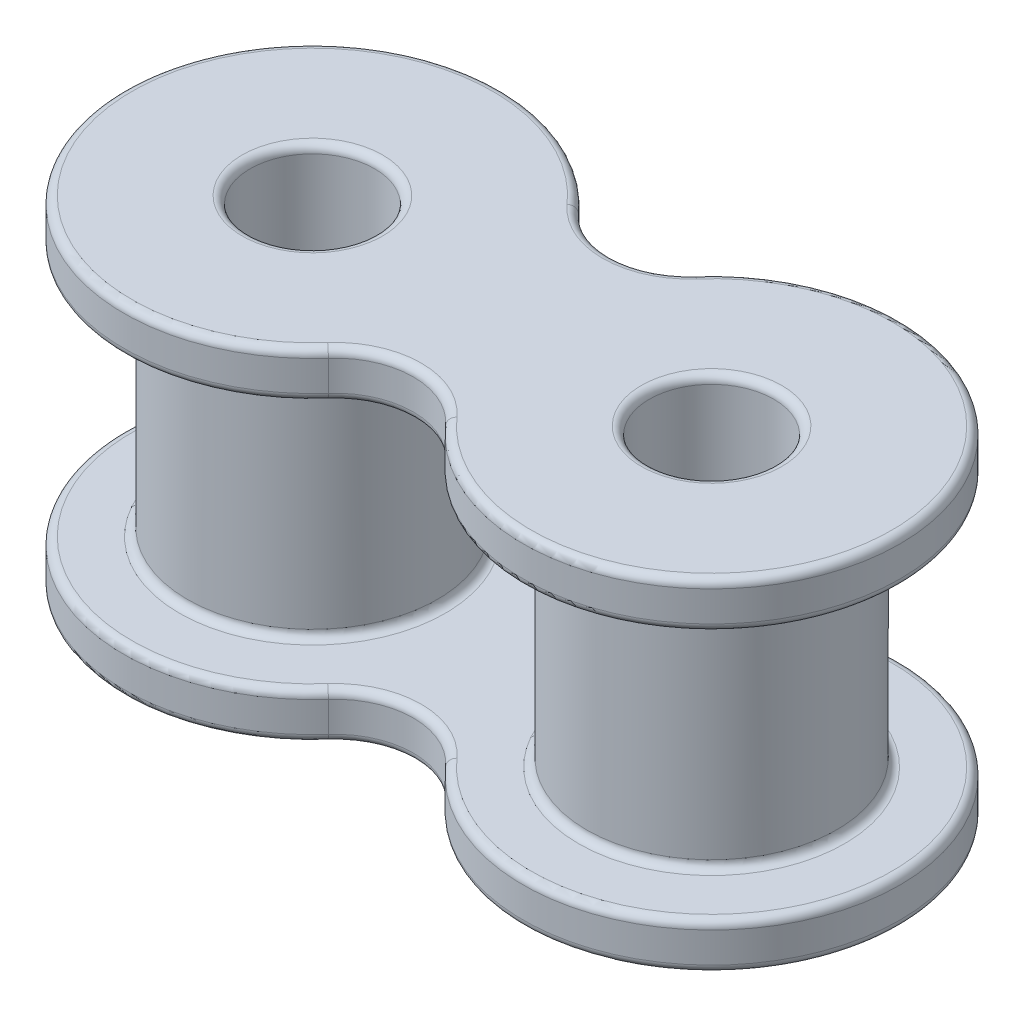
ISO-10303-21;
HEADER;
FILE_DESCRIPTION(('STEP AP214'),'2;1');
FILE_NAME('part.step','',(''),(''),'','','');
FILE_SCHEMA(('AUTOMOTIVE_DESIGN { 1 0 10303 214 1 1 1 1 }'));
ENDSEC;
DATA;
#1=APPLICATION_CONTEXT('core data for automotive mechanical design processes');
#2=APPLICATION_PROTOCOL_DEFINITION('international standard','automotive_design',2000,#1);
#3=PRODUCT_CONTEXT('',#1,'mechanical');
#4=PRODUCT('Part','Part','',(#3));
#5=PRODUCT_RELATED_PRODUCT_CATEGORY('part','',(#4));
#6=PRODUCT_DEFINITION_FORMATION('','',#4);
#7=PRODUCT_DEFINITION_CONTEXT('part definition',#1,'design');
#8=PRODUCT_DEFINITION('design','',#6,#7);
#9=PRODUCT_DEFINITION_SHAPE('','',#8);
#10=(LENGTH_UNIT() NAMED_UNIT(*) SI_UNIT(.MILLI.,.METRE.));
#11=(NAMED_UNIT(*) PLANE_ANGLE_UNIT() SI_UNIT($,.RADIAN.));
#12=(NAMED_UNIT(*) SI_UNIT($,.STERADIAN.) SOLID_ANGLE_UNIT());
#13=UNCERTAINTY_MEASURE_WITH_UNIT(LENGTH_MEASURE(1.E-05),#10,'distance_accuracy_value','');
#14=(GEOMETRIC_REPRESENTATION_CONTEXT(3) GLOBAL_UNCERTAINTY_ASSIGNED_CONTEXT((#13)) GLOBAL_UNIT_ASSIGNED_CONTEXT((#10,
#11,#12)) REPRESENTATION_CONTEXT('',''));
#15=CARTESIAN_POINT('',(0.,0.,0.));
#16=DIRECTION('',(0.,0.,1.));
#17=DIRECTION('',(1.,0.,0.));
#18=AXIS2_PLACEMENT_3D('',#15,#16,#17);
#19=CARTESIAN_POINT('',(3.175,0.7366,-2.81610900547326));
#20=DIRECTION('',(0.,1.,0.));
#21=DIRECTION('',(0.,0.,1.));
#22=AXIS2_PLACEMENT_3D('',#19,#20,#21);
#23=PLANE('',#22);
#24=CARTESIAN_POINT('',(-6.35,0.7366,0.));
#25=DIRECTION('',(0.,1.,0.));
#26=DIRECTION('',(0.,0.,1.));
#27=AXIS2_PLACEMENT_3D('',#24,#25,#26);
#28=CIRCLE('',#27,4.2291);
#29=CARTESIAN_POINT('',(-6.35,0.7366,4.2291));
#30=VERTEX_POINT('',#29);
#31=EDGE_CURVE('E201',#30,#30,#28,.F.);
#32=ORIENTED_EDGE('',*,*,#31,.T.);
#33=EDGE_LOOP('',(#32));
#34=FACE_BOUND('',#33,.T.);
#35=CARTESIAN_POINT('',(6.35,0.7366,0.));
#36=DIRECTION('',(0.,1.,0.));
#37=DIRECTION('',(0.,0.,1.));
#38=AXIS2_PLACEMENT_3D('',#35,#36,#37);
#39=CIRCLE('',#38,4.2291);
#40=CARTESIAN_POINT('',(6.35,0.7366,4.2291));
#41=VERTEX_POINT('',#40);
#42=EDGE_CURVE('E196',#41,#41,#39,.F.);
#43=ORIENTED_EDGE('',*,*,#42,.T.);
#44=EDGE_LOOP('',(#43));
#45=FACE_BOUND('',#44,.T.);
#46=CARTESIAN_POINT('',(6.35,0.7366,0.));
#47=DIRECTION('',(0.,1.,0.));
#48=DIRECTION('',(0.,0.,1.));
#49=AXIS2_PLACEMENT_3D('',#46,#47,#48);
#50=CIRCLE('',#49,5.7404);
#51=CARTESIAN_POINT('',(2.05546815225198,0.7366,3.80909285377477));
#52=VERTEX_POINT('',#51);
#53=CARTESIAN_POINT('',(2.05546815225198,0.7366,-3.80909285377477));
#54=VERTEX_POINT('',#53);
#55=EDGE_CURVE('E193',#52,#54,#50,.T.);
#56=ORIENTED_EDGE('',*,*,#55,.T.);
#57=CARTESIAN_POINT('',(0.,0.7366,-5.63221801094651));
#58=DIRECTION('',(0.,1.,0.));
#59=DIRECTION('',(0.,0.,1.));
#60=AXIS2_PLACEMENT_3D('',#57,#58,#59);
#61=CIRCLE('',#60,2.74749607163225);
#62=CARTESIAN_POINT('',(-2.05546815225198,0.7366,-3.80909285377477));
#63=VERTEX_POINT('',#62);
#64=EDGE_CURVE('E172',#54,#63,#61,.F.);
#65=ORIENTED_EDGE('',*,*,#64,.T.);
#66=CARTESIAN_POINT('',(-6.35,0.7366,0.));
#67=DIRECTION('',(0.,1.,0.));
#68=DIRECTION('',(0.,0.,1.));
#69=AXIS2_PLACEMENT_3D('',#66,#67,#68);
#70=CIRCLE('',#69,5.7404);
#71=CARTESIAN_POINT('',(-2.05546815225198,0.7366,3.80909285377477));
#72=VERTEX_POINT('',#71);
#73=EDGE_CURVE('E182',#63,#72,#70,.T.);
#74=ORIENTED_EDGE('',*,*,#73,.T.);
#75=CARTESIAN_POINT('',(0.,0.7366,5.63221801094651));
#76=DIRECTION('',(0.,1.,0.));
#77=DIRECTION('',(0.,0.,1.));
#78=AXIS2_PLACEMENT_3D('',#75,#76,#77);
#79=CIRCLE('',#78,2.74749607163225);
#80=EDGE_CURVE('E189',#72,#52,#79,.F.);
#81=ORIENTED_EDGE('',*,*,#80,.T.);
#82=EDGE_LOOP('',(#56,#65,#74,#81));
#83=FACE_BOUND('',#82,.T.);
#84=ADVANCED_FACE('F48',(#34,#45,#83),#23,.T.);
#85=CARTESIAN_POINT('',(3.175,-0.7366,-2.81610900547326));
#86=DIRECTION('',(0.,1.,0.));
#87=DIRECTION('',(0.,0.,1.));
#88=AXIS2_PLACEMENT_3D('',#85,#86,#87);
#89=PLANE('',#88);
#90=CARTESIAN_POINT('',(6.35,-0.7366,0.));
#91=DIRECTION('',(0.,1.,0.));
#92=DIRECTION('',(0.,0.,1.));
#93=AXIS2_PLACEMENT_3D('',#90,#91,#92);
#94=CIRCLE('',#93,2.2352);
#95=CARTESIAN_POINT('',(6.35,-0.7366,2.2352));
#96=VERTEX_POINT('',#95);
#97=EDGE_CURVE('E250',#96,#96,#94,.T.);
#98=ORIENTED_EDGE('',*,*,#97,.T.);
#99=EDGE_LOOP('',(#98));
#100=FACE_BOUND('',#99,.T.);
#101=CARTESIAN_POINT('',(-6.35,-0.7366,0.));
#102=DIRECTION('',(0.,1.,0.));
#103=DIRECTION('',(0.,0.,1.));
#104=AXIS2_PLACEMENT_3D('',#101,#102,#103);
#105=CIRCLE('',#104,2.2352);
#106=CARTESIAN_POINT('',(-6.35,-0.7366,2.2352));
#107=VERTEX_POINT('',#106);
#108=EDGE_CURVE('E246',#107,#107,#105,.T.);
#109=ORIENTED_EDGE('',*,*,#108,.T.);
#110=EDGE_LOOP('',(#109));
#111=FACE_BOUND('',#110,.T.);
#112=CARTESIAN_POINT('',(0.,-0.7366,5.63221801094651));
#113=DIRECTION('',(0.,1.,0.));
#114=DIRECTION('',(0.,0.,1.));
#115=AXIS2_PLACEMENT_3D('',#112,#113,#114);
#116=CIRCLE('',#115,2.74749607163225);
#117=CARTESIAN_POINT('',(2.05546815225198,-0.7366,3.80909285377476));
#118=VERTEX_POINT('',#117);
#119=CARTESIAN_POINT('',(-2.05546815225198,-0.7366,3.80909285377476));
#120=VERTEX_POINT('',#119);
#121=EDGE_CURVE('E236',#118,#120,#116,.T.);
#122=ORIENTED_EDGE('',*,*,#121,.T.);
#123=CARTESIAN_POINT('',(-6.35,-0.7366,0.));
#124=DIRECTION('',(0.,1.,0.));
#125=DIRECTION('',(0.,0.,1.));
#126=AXIS2_PLACEMENT_3D('',#123,#124,#125);
#127=CIRCLE('',#126,5.7404);
#128=CARTESIAN_POINT('',(-2.05546815225198,-0.7366,-3.80909285377477));
#129=VERTEX_POINT('',#128);
#130=EDGE_CURVE('E242',#120,#129,#127,.F.);
#131=ORIENTED_EDGE('',*,*,#130,.T.);
#132=CARTESIAN_POINT('',(0.,-0.7366,-5.63221801094651));
#133=DIRECTION('',(0.,1.,0.));
#134=DIRECTION('',(0.,0.,1.));
#135=AXIS2_PLACEMENT_3D('',#132,#133,#134);
#136=CIRCLE('',#135,2.74749607163225);
#137=CARTESIAN_POINT('',(2.05546815225198,-0.7366,-3.80909285377477));
#138=VERTEX_POINT('',#137);
#139=EDGE_CURVE('E239',#129,#138,#136,.T.);
#140=ORIENTED_EDGE('',*,*,#139,.T.);
#141=CARTESIAN_POINT('',(6.35,-0.7366,0.));
#142=DIRECTION('',(0.,1.,0.));
#143=DIRECTION('',(0.,0.,1.));
#144=AXIS2_PLACEMENT_3D('',#141,#142,#143);
#145=CIRCLE('',#144,5.7404);
#146=EDGE_CURVE('E233',#138,#118,#145,.F.);
#147=ORIENTED_EDGE('',*,*,#146,.T.);
#148=EDGE_LOOP('',(#122,#131,#140,#147));
#149=FACE_BOUND('',#148,.T.);
#150=ADVANCED_FACE('F469',(#100,#111,#149),#89,.F.);
#151=CARTESIAN_POINT('',(0.,0.7366,-5.63221801094651));
#152=DIRECTION('',(0.,-1.,0.));
#153=DIRECTION('',(0.,0.,-1.));
#154=AXIS2_PLACEMENT_3D('',#151,#152,#153);
#155=CYLINDRICAL_SURFACE('',#154,2.49349607163225);
#156=DIRECTION('',(0.,-1.,0.));
#157=VECTOR('',#156,1.);
#158=CARTESIAN_POINT('',(-1.86544461916579,0.7366,-3.97763678535772));
#159=LINE('',#158,#157);
#160=CARTESIAN_POINT('',(-1.86544461916579,0.4826,-3.97763678535772));
#161=VERTEX_POINT('',#160);
#162=CARTESIAN_POINT('',(-1.86544461916579,-0.4826,-3.97763678535772));
#163=VERTEX_POINT('',#162);
#164=EDGE_CURVE('E190',#161,#163,#159,.T.);
#165=ORIENTED_EDGE('',*,*,#164,.F.);
#166=CARTESIAN_POINT('',(0.,0.4826,-5.63221801094651));
#167=DIRECTION('',(0.,1.,0.));
#168=DIRECTION('',(0.,0.,1.));
#169=AXIS2_PLACEMENT_3D('',#166,#167,#168);
#170=CIRCLE('',#169,2.49349607163225);
#171=CARTESIAN_POINT('',(1.86544461916579,0.4826,-3.97763678535772));
#172=VERTEX_POINT('',#171);
#173=EDGE_CURVE('E174',#161,#172,#170,.T.);
#174=ORIENTED_EDGE('',*,*,#173,.T.);
#175=DIRECTION('',(0.,-1.,0.));
#176=VECTOR('',#175,1.);
#177=CARTESIAN_POINT('',(1.86544461916579,0.7366,-3.97763678535772));
#178=LINE('',#177,#176);
#179=CARTESIAN_POINT('',(1.86544461916579,-0.4826,-3.97763678535772));
#180=VERTEX_POINT('',#179);
#181=EDGE_CURVE('E279',#172,#180,#178,.T.);
#182=ORIENTED_EDGE('',*,*,#181,.T.);
#183=CARTESIAN_POINT('',(0.,-0.4826,-5.63221801094651));
#184=DIRECTION('',(0.,1.,0.));
#185=DIRECTION('',(0.,0.,1.));
#186=AXIS2_PLACEMENT_3D('',#183,#184,#185);
#187=CIRCLE('',#186,2.49349607163225);
#188=EDGE_CURVE('E209',#180,#163,#187,.F.);
#189=ORIENTED_EDGE('',*,*,#188,.T.);
#190=EDGE_LOOP('',(#165,#174,#182,#189));
#191=FACE_BOUND('',#190,.T.);
#192=ADVANCED_FACE('F453',(#191),#155,.F.);
#193=CARTESIAN_POINT('',(-6.35,0.7366,0.));
#194=DIRECTION('',(0.,-1.,0.));
#195=DIRECTION('',(0.,0.,-1.));
#196=AXIS2_PLACEMENT_3D('',#193,#194,#195);
#197=CYLINDRICAL_SURFACE('',#196,5.9944);
#198=ORIENTED_EDGE('',*,*,#164,.T.);
#199=CARTESIAN_POINT('',(-6.35,-0.4826,0.));
#200=DIRECTION('',(0.,1.,0.));
#201=DIRECTION('',(0.,0.,1.));
#202=AXIS2_PLACEMENT_3D('',#199,#200,#201);
#203=CIRCLE('',#202,5.9944);
#204=CARTESIAN_POINT('',(-1.86544461916578,-0.4826,3.97763678535772));
#205=VERTEX_POINT('',#204);
#206=EDGE_CURVE('E229',#163,#205,#203,.T.);
#207=ORIENTED_EDGE('',*,*,#206,.T.);
#208=DIRECTION('',(0.,-1.,0.));
#209=VECTOR('',#208,1.);
#210=CARTESIAN_POINT('',(-1.86544461916578,0.7366,3.97763678535772));
#211=LINE('',#210,#209);
#212=CARTESIAN_POINT('',(-1.86544461916578,0.4826,3.97763678535772));
#213=VERTEX_POINT('',#212);
#214=EDGE_CURVE('E434',#213,#205,#211,.T.);
#215=ORIENTED_EDGE('',*,*,#214,.F.);
#216=CARTESIAN_POINT('',(-6.35,0.4826,0.));
#217=DIRECTION('',(0.,1.,0.));
#218=DIRECTION('',(0.,0.,1.));
#219=AXIS2_PLACEMENT_3D('',#216,#217,#218);
#220=CIRCLE('',#219,5.9944);
#221=EDGE_CURVE('E226',#213,#161,#220,.F.);
#222=ORIENTED_EDGE('',*,*,#221,.T.);
#223=EDGE_LOOP('',(#198,#207,#215,#222));
#224=FACE_BOUND('',#223,.T.);
#225=ADVANCED_FACE('F478',(#224),#197,.T.);
#226=CARTESIAN_POINT('',(0.,0.7366,5.63221801094651));
#227=DIRECTION('',(0.,-1.,0.));
#228=DIRECTION('',(0.,0.,-1.));
#229=AXIS2_PLACEMENT_3D('',#226,#227,#228);
#230=CYLINDRICAL_SURFACE('',#229,2.49349607163225);
#231=DIRECTION('',(0.,-1.,0.));
#232=VECTOR('',#231,1.);
#233=CARTESIAN_POINT('',(1.86544461916579,0.7366,3.97763678535772));
#234=LINE('',#233,#232);
#235=CARTESIAN_POINT('',(1.86544461916579,0.4826,3.97763678535772));
#236=VERTEX_POINT('',#235);
#237=CARTESIAN_POINT('',(1.86544461916579,-0.4826,3.97763678535772));
#238=VERTEX_POINT('',#237);
#239=EDGE_CURVE('E430',#236,#238,#234,.T.);
#240=ORIENTED_EDGE('',*,*,#239,.F.);
#241=CARTESIAN_POINT('',(0.,0.4826,5.63221801094651));
#242=DIRECTION('',(0.,1.,0.));
#243=DIRECTION('',(0.,0.,1.));
#244=AXIS2_PLACEMENT_3D('',#241,#242,#243);
#245=CIRCLE('',#244,2.49349607163225);
#246=EDGE_CURVE('E223',#236,#213,#245,.T.);
#247=ORIENTED_EDGE('',*,*,#246,.T.);
#248=ORIENTED_EDGE('',*,*,#214,.T.);
#249=CARTESIAN_POINT('',(0.,-0.4826,5.63221801094651));
#250=DIRECTION('',(0.,1.,0.));
#251=DIRECTION('',(0.,0.,1.));
#252=AXIS2_PLACEMENT_3D('',#249,#250,#251);
#253=CIRCLE('',#252,2.49349607163225);
#254=EDGE_CURVE('E220',#205,#238,#253,.F.);
#255=ORIENTED_EDGE('',*,*,#254,.T.);
#256=EDGE_LOOP('',(#240,#247,#248,#255));
#257=FACE_BOUND('',#256,.T.);
#258=ADVANCED_FACE('F481',(#257),#230,.F.);
#259=CARTESIAN_POINT('',(6.35,0.7366,0.));
#260=DIRECTION('',(0.,-1.,0.));
#261=DIRECTION('',(0.,0.,-1.));
#262=AXIS2_PLACEMENT_3D('',#259,#260,#261);
#263=CYLINDRICAL_SURFACE('',#262,5.9944);
#264=ORIENTED_EDGE('',*,*,#181,.F.);
#265=CARTESIAN_POINT('',(6.35,0.4826,0.));
#266=DIRECTION('',(0.,1.,0.));
#267=DIRECTION('',(0.,0.,1.));
#268=AXIS2_PLACEMENT_3D('',#265,#266,#267);
#269=CIRCLE('',#268,5.9944);
#270=EDGE_CURVE('E217',#172,#236,#269,.F.);
#271=ORIENTED_EDGE('',*,*,#270,.T.);
#272=ORIENTED_EDGE('',*,*,#239,.T.);
#273=CARTESIAN_POINT('',(6.35,-0.4826,0.));
#274=DIRECTION('',(0.,1.,0.));
#275=DIRECTION('',(0.,0.,1.));
#276=AXIS2_PLACEMENT_3D('',#273,#274,#275);
#277=CIRCLE('',#276,5.9944);
#278=EDGE_CURVE('E214',#238,#180,#277,.T.);
#279=ORIENTED_EDGE('',*,*,#278,.T.);
#280=EDGE_LOOP('',(#264,#271,#272,#279));
#281=FACE_BOUND('',#280,.T.);
#282=ADVANCED_FACE('F455',(#281),#263,.T.);
#283=CARTESIAN_POINT('',(-6.35,0.7366,0.));
#284=DIRECTION('',(0.,-1.,0.));
#285=DIRECTION('',(0.,0.,-1.));
#286=AXIS2_PLACEMENT_3D('',#283,#284,#285);
#287=CYLINDRICAL_SURFACE('',#286,1.9812);
#288=CARTESIAN_POINT('',(-6.35,9.8806,0.));
#289=DIRECTION('',(0.,-1.,0.));
#290=DIRECTION('',(0.,0.,-1.));
#291=AXIS2_PLACEMENT_3D('',#288,#289,#290);
#292=CIRCLE('',#291,1.9812);
#293=CARTESIAN_POINT('',(-6.35,9.8806,-1.9812));
#294=VERTEX_POINT('',#293);
#295=EDGE_CURVE('E11',#294,#294,#292,.F.);
#296=ORIENTED_EDGE('',*,*,#295,.T.);
#297=EDGE_LOOP('',(#296));
#298=FACE_BOUND('',#297,.T.);
#299=CARTESIAN_POINT('',(-6.35,-0.4826,0.));
#300=DIRECTION('',(0.,1.,0.));
#301=DIRECTION('',(0.,0.,1.));
#302=AXIS2_PLACEMENT_3D('',#299,#300,#301);
#303=CIRCLE('',#302,1.9812);
#304=CARTESIAN_POINT('',(-6.35,-0.4826,1.9812));
#305=VERTEX_POINT('',#304);
#306=EDGE_CURVE('E266',#305,#305,#303,.F.);
#307=ORIENTED_EDGE('',*,*,#306,.T.);
#308=EDGE_LOOP('',(#307));
#309=FACE_BOUND('',#308,.T.);
#310=ADVANCED_FACE('F488',(#298,#309),#287,.F.);
#311=CARTESIAN_POINT('',(6.35,0.7366,0.));
#312=DIRECTION('',(0.,-1.,0.));
#313=DIRECTION('',(0.,0.,-1.));
#314=AXIS2_PLACEMENT_3D('',#311,#312,#313);
#315=CYLINDRICAL_SURFACE('',#314,1.9812);
#316=CARTESIAN_POINT('',(6.35,9.8806,0.));
#317=DIRECTION('',(0.,-1.,0.));
#318=DIRECTION('',(0.,0.,-1.));
#319=AXIS2_PLACEMENT_3D('',#316,#317,#318);
#320=CIRCLE('',#319,1.9812);
#321=CARTESIAN_POINT('',(6.35,9.8806,-1.9812));
#322=VERTEX_POINT('',#321);
#323=EDGE_CURVE('E58',#322,#322,#320,.F.);
#324=ORIENTED_EDGE('',*,*,#323,.T.);
#325=EDGE_LOOP('',(#324));
#326=FACE_BOUND('',#325,.T.);
#327=CARTESIAN_POINT('',(6.35,-0.4826,0.));
#328=DIRECTION('',(0.,1.,0.));
#329=DIRECTION('',(0.,0.,1.));
#330=AXIS2_PLACEMENT_3D('',#327,#328,#329);
#331=CIRCLE('',#330,1.9812);
#332=CARTESIAN_POINT('',(6.35,-0.4826,1.9812));
#333=VERTEX_POINT('',#332);
#334=EDGE_CURVE('E262',#333,#333,#331,.F.);
#335=ORIENTED_EDGE('',*,*,#334,.T.);
#336=EDGE_LOOP('',(#335));
#337=FACE_BOUND('',#336,.T.);
#338=ADVANCED_FACE('F503',(#326,#337),#315,.F.);
#339=CARTESIAN_POINT('',(6.35,8.6614,0.));
#340=DIRECTION('',(0.,-1.,0.));
#341=DIRECTION('',(0.,0.,-1.));
#342=AXIS2_PLACEMENT_3D('',#339,#340,#341);
#343=CYLINDRICAL_SURFACE('',#342,3.9751);
#344=CARTESIAN_POINT('',(6.35,8.4074,0.));
#345=DIRECTION('',(0.,-1.,0.));
#346=DIRECTION('',(0.,0.,-1.));
#347=AXIS2_PLACEMENT_3D('',#344,#345,#346);
#348=CIRCLE('',#347,3.9751);
#349=CARTESIAN_POINT('',(6.35,8.4074,-3.9751));
#350=VERTEX_POINT('',#349);
#351=EDGE_CURVE('E363',#350,#350,#348,.T.);
#352=ORIENTED_EDGE('',*,*,#351,.T.);
#353=EDGE_LOOP('',(#352));
#354=FACE_BOUND('',#353,.T.);
#355=CARTESIAN_POINT('',(6.35,0.990599999999999,0.));
#356=DIRECTION('',(0.,1.,0.));
#357=DIRECTION('',(0.,0.,1.));
#358=AXIS2_PLACEMENT_3D('',#355,#356,#357);
#359=CIRCLE('',#358,3.9751);
#360=CARTESIAN_POINT('',(6.35,0.990599999999999,3.9751));
#361=VERTEX_POINT('',#360);
#362=EDGE_CURVE('E258',#361,#361,#359,.T.);
#363=ORIENTED_EDGE('',*,*,#362,.T.);
#364=EDGE_LOOP('',(#363));
#365=FACE_BOUND('',#364,.T.);
#366=ADVANCED_FACE('F507',(#354,#365),#343,.T.);
#367=CARTESIAN_POINT('',(-6.35,8.6614,0.));
#368=DIRECTION('',(0.,-1.,0.));
#369=DIRECTION('',(0.,0.,-1.));
#370=AXIS2_PLACEMENT_3D('',#367,#368,#369);
#371=CYLINDRICAL_SURFACE('',#370,3.9751);
#372=CARTESIAN_POINT('',(-6.35,8.4074,0.));
#373=DIRECTION('',(0.,-1.,0.));
#374=DIRECTION('',(0.,0.,-1.));
#375=AXIS2_PLACEMENT_3D('',#372,#373,#374);
#376=CIRCLE('',#375,3.9751);
#377=CARTESIAN_POINT('',(-6.35,8.4074,-3.9751));
#378=VERTEX_POINT('',#377);
#379=EDGE_CURVE('E359',#378,#378,#376,.T.);
#380=ORIENTED_EDGE('',*,*,#379,.T.);
#381=EDGE_LOOP('',(#380));
#382=FACE_BOUND('',#381,.T.);
#383=CARTESIAN_POINT('',(-6.35,0.990599999999999,0.));
#384=DIRECTION('',(0.,1.,0.));
#385=DIRECTION('',(0.,0.,1.));
#386=AXIS2_PLACEMENT_3D('',#383,#384,#385);
#387=CIRCLE('',#386,3.9751);
#388=CARTESIAN_POINT('',(-6.35,0.990599999999999,3.9751));
#389=VERTEX_POINT('',#388);
#390=EDGE_CURVE('E254',#389,#389,#387,.T.);
#391=ORIENTED_EDGE('',*,*,#390,.T.);
#392=EDGE_LOOP('',(#391));
#393=FACE_BOUND('',#392,.T.);
#394=ADVANCED_FACE('F511',(#382,#393),#371,.T.);
#395=CARTESIAN_POINT('',(0.,0.4826,5.63221801094651));
#396=DIRECTION('',(0.,1.,0.));
#397=DIRECTION('',(0.,0.,1.));
#398=AXIS2_PLACEMENT_3D('',#395,#396,#397);
#399=TOROIDAL_SURFACE('',#398,2.74749607163225,0.254);
#400=CARTESIAN_POINT('',(-2.05546815225198,0.4826,3.80909285377476));
#401=DIRECTION('',(-0.663558785759664,0.,0.748124146008642));
#402=DIRECTION('',(0.748124146008642,0.,0.663558785759664));
#403=AXIS2_PLACEMENT_3D('',#400,#401,#402);
#404=CIRCLE('',#403,0.254);
#405=EDGE_CURVE('E185',#213,#72,#404,.T.);
#406=ORIENTED_EDGE('',*,*,#405,.F.);
#407=ORIENTED_EDGE('',*,*,#246,.F.);
#408=CARTESIAN_POINT('',(2.05546815225198,0.4826,3.80909285377477));
#409=DIRECTION('',(0.663558785759662,0.,0.748124146008644));
#410=DIRECTION('',(0.748124146008644,0.,-0.663558785759662));
#411=AXIS2_PLACEMENT_3D('',#408,#409,#410);
#412=CIRCLE('',#411,0.254);
#413=EDGE_CURVE('E275',#52,#236,#412,.T.);
#414=ORIENTED_EDGE('',*,*,#413,.F.);
#415=ORIENTED_EDGE('',*,*,#80,.F.);
#416=EDGE_LOOP('',(#406,#407,#414,#415));
#417=FACE_BOUND('',#416,.T.);
#418=ADVANCED_FACE('F444',(#417),#399,.T.);
#419=CARTESIAN_POINT('',(6.35,0.4826,0.));
#420=DIRECTION('',(0.,1.,0.));
#421=DIRECTION('',(0.,0.,1.));
#422=AXIS2_PLACEMENT_3D('',#419,#420,#421);
#423=TOROIDAL_SURFACE('',#422,5.7404,0.254);
#424=ORIENTED_EDGE('',*,*,#413,.T.);
#425=ORIENTED_EDGE('',*,*,#270,.F.);
#426=CARTESIAN_POINT('',(2.05546815225198,0.4826,-3.80909285377477));
#427=DIRECTION('',(-0.663558785759663,0.,0.748124146008643));
#428=DIRECTION('',(0.748124146008643,0.,0.663558785759663));
#429=AXIS2_PLACEMENT_3D('',#426,#427,#428);
#430=CIRCLE('',#429,0.254);
#431=EDGE_CURVE('E178',#54,#172,#430,.T.);
#432=ORIENTED_EDGE('',*,*,#431,.F.);
#433=ORIENTED_EDGE('',*,*,#55,.F.);
#434=EDGE_LOOP('',(#424,#425,#432,#433));
#435=FACE_BOUND('',#434,.T.);
#436=ADVANCED_FACE('F447',(#435),#423,.T.);
#437=CARTESIAN_POINT('',(-6.35,0.4826,0.));
#438=DIRECTION('',(0.,1.,0.));
#439=DIRECTION('',(0.,0.,1.));
#440=AXIS2_PLACEMENT_3D('',#437,#438,#439);
#441=TOROIDAL_SURFACE('',#440,5.7404,0.254);
#442=ORIENTED_EDGE('',*,*,#405,.T.);
#443=ORIENTED_EDGE('',*,*,#73,.F.);
#444=CARTESIAN_POINT('',(-2.05546815225198,0.4826,-3.80909285377477));
#445=DIRECTION('',(0.663558785759663,0.,0.748124146008643));
#446=DIRECTION('',(0.748124146008643,0.,-0.663558785759663));
#447=AXIS2_PLACEMENT_3D('',#444,#445,#446);
#448=CIRCLE('',#447,0.254);
#449=EDGE_CURVE('E168',#161,#63,#448,.T.);
#450=ORIENTED_EDGE('',*,*,#449,.F.);
#451=ORIENTED_EDGE('',*,*,#221,.F.);
#452=EDGE_LOOP('',(#442,#443,#450,#451));
#453=FACE_BOUND('',#452,.T.);
#454=ADVANCED_FACE('F183',(#453),#441,.T.);
#455=CARTESIAN_POINT('',(0.,0.4826,-5.63221801094651));
#456=DIRECTION('',(0.,1.,0.));
#457=DIRECTION('',(0.,0.,1.));
#458=AXIS2_PLACEMENT_3D('',#455,#456,#457);
#459=TOROIDAL_SURFACE('',#458,2.74749607163225,0.254);
#460=ORIENTED_EDGE('',*,*,#431,.T.);
#461=ORIENTED_EDGE('',*,*,#173,.F.);
#462=ORIENTED_EDGE('',*,*,#449,.T.);
#463=ORIENTED_EDGE('',*,*,#64,.F.);
#464=EDGE_LOOP('',(#460,#461,#462,#463));
#465=FACE_BOUND('',#464,.T.);
#466=ADVANCED_FACE('F170',(#465),#459,.T.);
#467=CARTESIAN_POINT('',(6.35,-0.4826,0.));
#468=DIRECTION('',(0.,1.,0.));
#469=DIRECTION('',(0.,0.,1.));
#470=AXIS2_PLACEMENT_3D('',#467,#468,#469);
#471=TOROIDAL_SURFACE('',#470,5.7404,0.254);
#472=CARTESIAN_POINT('',(2.05546815225198,-0.4826,3.80909285377476));
#473=DIRECTION('',(-0.663558785759664,0.,-0.748124146008643));
#474=DIRECTION('',(-0.748124146008643,0.,0.663558785759664));
#475=AXIS2_PLACEMENT_3D('',#472,#473,#474);
#476=CIRCLE('',#475,0.254);
#477=EDGE_CURVE('E287',#118,#238,#476,.T.);
#478=ORIENTED_EDGE('',*,*,#477,.F.);
#479=ORIENTED_EDGE('',*,*,#146,.F.);
#480=CARTESIAN_POINT('',(2.05546815225198,-0.4826,-3.80909285377477));
#481=DIRECTION('',(-0.663558785759662,0.,0.748124146008644));
#482=DIRECTION('',(0.748124146008644,0.,0.663558785759662));
#483=AXIS2_PLACEMENT_3D('',#480,#481,#482);
#484=CIRCLE('',#483,0.254);
#485=EDGE_CURVE('E179',#180,#138,#484,.T.);
#486=ORIENTED_EDGE('',*,*,#485,.F.);
#487=ORIENTED_EDGE('',*,*,#278,.F.);
#488=EDGE_LOOP('',(#478,#479,#486,#487));
#489=FACE_BOUND('',#488,.T.);
#490=ADVANCED_FACE('F459',(#489),#471,.T.);
#491=CARTESIAN_POINT('',(0.,-0.4826,-5.63221801094651));
#492=DIRECTION('',(0.,1.,0.));
#493=DIRECTION('',(0.,0.,1.));
#494=AXIS2_PLACEMENT_3D('',#491,#492,#493);
#495=TOROIDAL_SURFACE('',#494,2.74749607163225,0.254);
#496=ORIENTED_EDGE('',*,*,#485,.T.);
#497=ORIENTED_EDGE('',*,*,#139,.F.);
#498=CARTESIAN_POINT('',(-2.05546815225198,-0.4826,-3.80909285377477));
#499=DIRECTION('',(-0.663558785759663,0.,-0.748124146008643));
#500=DIRECTION('',(-0.748124146008643,0.,0.663558785759663));
#501=AXIS2_PLACEMENT_3D('',#498,#499,#500);
#502=CIRCLE('',#501,0.254);
#503=EDGE_CURVE('E283',#163,#129,#502,.T.);
#504=ORIENTED_EDGE('',*,*,#503,.F.);
#505=ORIENTED_EDGE('',*,*,#188,.F.);
#506=EDGE_LOOP('',(#496,#497,#504,#505));
#507=FACE_BOUND('',#506,.T.);
#508=ADVANCED_FACE('F476',(#507),#495,.T.);
#509=CARTESIAN_POINT('',(0.,-0.4826,5.63221801094651));
#510=DIRECTION('',(0.,1.,0.));
#511=DIRECTION('',(0.,0.,1.));
#512=AXIS2_PLACEMENT_3D('',#509,#510,#511);
#513=TOROIDAL_SURFACE('',#512,2.74749607163225,0.254);
#514=ORIENTED_EDGE('',*,*,#477,.T.);
#515=ORIENTED_EDGE('',*,*,#254,.F.);
#516=CARTESIAN_POINT('',(-2.05546815225198,-0.4826,3.80909285377476));
#517=DIRECTION('',(-0.663558785759662,0.,0.748124146008644));
#518=DIRECTION('',(0.748124146008644,0.,0.663558785759662));
#519=AXIS2_PLACEMENT_3D('',#516,#517,#518);
#520=CIRCLE('',#519,0.254);
#521=EDGE_CURVE('E280',#120,#205,#520,.T.);
#522=ORIENTED_EDGE('',*,*,#521,.F.);
#523=ORIENTED_EDGE('',*,*,#121,.F.);
#524=EDGE_LOOP('',(#514,#515,#522,#523));
#525=FACE_BOUND('',#524,.T.);
#526=ADVANCED_FACE('F465',(#525),#513,.T.);
#527=CARTESIAN_POINT('',(-6.35,-0.4826,0.));
#528=DIRECTION('',(0.,1.,0.));
#529=DIRECTION('',(0.,0.,1.));
#530=AXIS2_PLACEMENT_3D('',#527,#528,#529);
#531=TOROIDAL_SURFACE('',#530,5.7404,0.254);
#532=ORIENTED_EDGE('',*,*,#503,.T.);
#533=ORIENTED_EDGE('',*,*,#130,.F.);
#534=ORIENTED_EDGE('',*,*,#521,.T.);
#535=ORIENTED_EDGE('',*,*,#206,.F.);
#536=EDGE_LOOP('',(#532,#533,#534,#535));
#537=FACE_BOUND('',#536,.T.);
#538=ADVANCED_FACE('F471',(#537),#531,.T.);
#539=CARTESIAN_POINT('',(-6.35,0.990599999999999,0.));
#540=DIRECTION('',(0.,1.,0.));
#541=DIRECTION('',(0.,0.,1.));
#542=AXIS2_PLACEMENT_3D('',#539,#540,#541);
#543=TOROIDAL_SURFACE('',#542,4.2291,0.254);
#544=ORIENTED_EDGE('',*,*,#31,.F.);
#545=EDGE_LOOP('',(#544));
#546=FACE_BOUND('',#545,.T.);
#547=ORIENTED_EDGE('',*,*,#390,.F.);
#548=EDGE_LOOP('',(#547));
#549=FACE_BOUND('',#548,.T.);
#550=ADVANCED_FACE('F835',(#546,#549),#543,.F.);
#551=CARTESIAN_POINT('',(6.35,0.990599999999999,0.));
#552=DIRECTION('',(0.,1.,0.));
#553=DIRECTION('',(0.,0.,1.));
#554=AXIS2_PLACEMENT_3D('',#551,#552,#553);
#555=TOROIDAL_SURFACE('',#554,4.2291,0.254);
#556=ORIENTED_EDGE('',*,*,#42,.F.);
#557=EDGE_LOOP('',(#556));
#558=FACE_BOUND('',#557,.T.);
#559=ORIENTED_EDGE('',*,*,#362,.F.);
#560=EDGE_LOOP('',(#559));
#561=FACE_BOUND('',#560,.T.);
#562=ADVANCED_FACE('F596',(#558,#561),#555,.F.);
#563=CARTESIAN_POINT('',(6.35,-0.4826,0.));
#564=DIRECTION('',(0.,1.,0.));
#565=DIRECTION('',(0.,0.,1.));
#566=AXIS2_PLACEMENT_3D('',#563,#564,#565);
#567=TOROIDAL_SURFACE('',#566,2.2352,0.254);
#568=ORIENTED_EDGE('',*,*,#334,.F.);
#569=EDGE_LOOP('',(#568));
#570=FACE_BOUND('',#569,.T.);
#571=ORIENTED_EDGE('',*,*,#97,.F.);
#572=EDGE_LOOP('',(#571));
#573=FACE_BOUND('',#572,.T.);
#574=ADVANCED_FACE('F593',(#570,#573),#567,.T.);
#575=CARTESIAN_POINT('',(-6.35,-0.4826,0.));
#576=DIRECTION('',(0.,1.,0.));
#577=DIRECTION('',(0.,0.,1.));
#578=AXIS2_PLACEMENT_3D('',#575,#576,#577);
#579=TOROIDAL_SURFACE('',#578,2.2352,0.254);
#580=ORIENTED_EDGE('',*,*,#306,.F.);
#581=EDGE_LOOP('',(#580));
#582=FACE_BOUND('',#581,.T.);
#583=ORIENTED_EDGE('',*,*,#108,.F.);
#584=EDGE_LOOP('',(#583));
#585=FACE_BOUND('',#584,.T.);
#586=ADVANCED_FACE('F519',(#582,#585),#579,.T.);
#587=CARTESIAN_POINT('',(0.,8.6614,-5.63221801094651));
#588=DIRECTION('',(0.,1.,0.));
#589=DIRECTION('',(0.,0.,1.));
#590=AXIS2_PLACEMENT_3D('',#587,#588,#589);
#591=CYLINDRICAL_SURFACE('',#590,2.49349607163225);
#592=DIRECTION('',(0.,1.,0.));
#593=VECTOR('',#592,1.);
#594=CARTESIAN_POINT('',(1.86544461916579,8.6614,-3.97763678535772));
#595=LINE('',#594,#593);
#596=CARTESIAN_POINT('',(1.86544461916579,8.9154,-3.97763678535772));
#597=VERTEX_POINT('',#596);
#598=CARTESIAN_POINT('',(1.86544461916579,9.8806,-3.97763678535772));
#599=VERTEX_POINT('',#598);
#600=EDGE_CURVE('E284',#597,#599,#595,.T.);
#601=ORIENTED_EDGE('',*,*,#600,.F.);
#602=CARTESIAN_POINT('',(0.,8.9154,-5.63221801094651));
#603=DIRECTION('',(0.,-1.,0.));
#604=DIRECTION('',(0.,0.,-1.));
#605=AXIS2_PLACEMENT_3D('',#602,#603,#604);
#606=CIRCLE('',#605,2.49349607163225);
#607=CARTESIAN_POINT('',(-1.86544461916579,8.9154,-3.97763678535772));
#608=VERTEX_POINT('',#607);
#609=EDGE_CURVE('E296',#597,#608,#606,.T.);
#610=ORIENTED_EDGE('',*,*,#609,.T.);
#611=DIRECTION('',(0.,1.,0.));
#612=VECTOR('',#611,1.);
#613=CARTESIAN_POINT('',(-1.86544461916579,8.6614,-3.97763678535772));
#614=LINE('',#613,#612);
#615=CARTESIAN_POINT('',(-1.86544461916579,9.8806,-3.97763678535772));
#616=VERTEX_POINT('',#615);
#617=EDGE_CURVE('E384',#608,#616,#614,.T.);
#618=ORIENTED_EDGE('',*,*,#617,.T.);
#619=CARTESIAN_POINT('',(0.,9.8806,-5.63221801094651));
#620=DIRECTION('',(0.,-1.,0.));
#621=DIRECTION('',(0.,0.,-1.));
#622=AXIS2_PLACEMENT_3D('',#619,#620,#621);
#623=CIRCLE('',#622,2.49349607163225);
#624=EDGE_CURVE('E269',#616,#599,#623,.F.);
#625=ORIENTED_EDGE('',*,*,#624,.T.);
#626=EDGE_LOOP('',(#601,#610,#618,#625));
#627=FACE_BOUND('',#626,.T.);
#628=ADVANCED_FACE('F516',(#627),#591,.F.);
#629=CARTESIAN_POINT('',(6.35,8.6614,0.));
#630=DIRECTION('',(0.,1.,0.));
#631=DIRECTION('',(0.,0.,1.));
#632=AXIS2_PLACEMENT_3D('',#629,#630,#631);
#633=CYLINDRICAL_SURFACE('',#632,5.9944);
#634=DIRECTION('',(0.,1.,0.));
#635=VECTOR('',#634,1.);
#636=CARTESIAN_POINT('',(1.86544461916579,8.6614,3.97763678535772));
#637=LINE('',#636,#635);
#638=CARTESIAN_POINT('',(1.86544461916579,8.9154,3.97763678535772));
#639=VERTEX_POINT('',#638);
#640=CARTESIAN_POINT('',(1.86544461916579,9.8806,3.97763678535772));
#641=VERTEX_POINT('',#640);
#642=EDGE_CURVE('E410',#639,#641,#637,.T.);
#643=ORIENTED_EDGE('',*,*,#642,.F.);
#644=CARTESIAN_POINT('',(6.35,8.9154,0.));
#645=DIRECTION('',(0.,-1.,0.));
#646=DIRECTION('',(0.,0.,-1.));
#647=AXIS2_PLACEMENT_3D('',#644,#645,#646);
#648=CIRCLE('',#647,5.9944);
#649=EDGE_CURVE('E324',#639,#597,#648,.F.);
#650=ORIENTED_EDGE('',*,*,#649,.T.);
#651=ORIENTED_EDGE('',*,*,#600,.T.);
#652=CARTESIAN_POINT('',(6.35,9.8806,0.));
#653=DIRECTION('',(0.,-1.,0.));
#654=DIRECTION('',(0.,0.,-1.));
#655=AXIS2_PLACEMENT_3D('',#652,#653,#654);
#656=CIRCLE('',#655,5.9944);
#657=EDGE_CURVE('E321',#599,#641,#656,.T.);
#658=ORIENTED_EDGE('',*,*,#657,.T.);
#659=EDGE_LOOP('',(#643,#650,#651,#658));
#660=FACE_BOUND('',#659,.T.);
#661=ADVANCED_FACE('F409',(#660),#633,.T.);
#662=CARTESIAN_POINT('',(0.,8.6614,5.63221801094651));
#663=DIRECTION('',(0.,1.,0.));
#664=DIRECTION('',(0.,0.,1.));
#665=AXIS2_PLACEMENT_3D('',#662,#663,#664);
#666=CYLINDRICAL_SURFACE('',#665,2.49349607163225);
#667=DIRECTION('',(0.,1.,0.));
#668=VECTOR('',#667,1.);
#669=CARTESIAN_POINT('',(-1.86544461916578,8.6614,3.97763678535772));
#670=LINE('',#669,#668);
#671=CARTESIAN_POINT('',(-1.86544461916578,8.9154,3.97763678535772));
#672=VERTEX_POINT('',#671);
#673=CARTESIAN_POINT('',(-1.86544461916578,9.8806,3.97763678535772));
#674=VERTEX_POINT('',#673);
#675=EDGE_CURVE('E419',#672,#674,#670,.T.);
#676=ORIENTED_EDGE('',*,*,#675,.F.);
#677=CARTESIAN_POINT('',(0.,8.9154,5.63221801094651));
#678=DIRECTION('',(0.,-1.,0.));
#679=DIRECTION('',(0.,0.,-1.));
#680=AXIS2_PLACEMENT_3D('',#677,#678,#679);
#681=CIRCLE('',#680,2.49349607163225);
#682=EDGE_CURVE('E330',#672,#639,#681,.T.);
#683=ORIENTED_EDGE('',*,*,#682,.T.);
#684=ORIENTED_EDGE('',*,*,#642,.T.);
#685=CARTESIAN_POINT('',(0.,9.8806,5.63221801094651));
#686=DIRECTION('',(0.,-1.,0.));
#687=DIRECTION('',(0.,0.,-1.));
#688=AXIS2_PLACEMENT_3D('',#685,#686,#687);
#689=CIRCLE('',#688,2.49349607163225);
#690=EDGE_CURVE('E327',#641,#674,#689,.F.);
#691=ORIENTED_EDGE('',*,*,#690,.T.);
#692=EDGE_LOOP('',(#676,#683,#684,#691));
#693=FACE_BOUND('',#692,.T.);
#694=ADVANCED_FACE('F415',(#693),#666,.F.);
#695=CARTESIAN_POINT('',(-6.35,8.6614,0.));
#696=DIRECTION('',(0.,1.,0.));
#697=DIRECTION('',(0.,0.,1.));
#698=AXIS2_PLACEMENT_3D('',#695,#696,#697);
#699=CYLINDRICAL_SURFACE('',#698,5.9944);
#700=ORIENTED_EDGE('',*,*,#675,.T.);
#701=CARTESIAN_POINT('',(-6.35,9.8806,0.));
#702=DIRECTION('',(0.,-1.,0.));
#703=DIRECTION('',(0.,0.,-1.));
#704=AXIS2_PLACEMENT_3D('',#701,#702,#703);
#705=CIRCLE('',#704,5.9944);
#706=EDGE_CURVE('E355',#674,#616,#705,.T.);
#707=ORIENTED_EDGE('',*,*,#706,.T.);
#708=ORIENTED_EDGE('',*,*,#617,.F.);
#709=CARTESIAN_POINT('',(-6.35,8.9154,0.));
#710=DIRECTION('',(0.,-1.,0.));
#711=DIRECTION('',(0.,0.,-1.));
#712=AXIS2_PLACEMENT_3D('',#709,#710,#711);
#713=CIRCLE('',#712,5.9944);
#714=EDGE_CURVE('E352',#608,#672,#713,.F.);
#715=ORIENTED_EDGE('',*,*,#714,.T.);
#716=EDGE_LOOP('',(#700,#707,#708,#715));
#717=FACE_BOUND('',#716,.T.);
#718=ADVANCED_FACE('F525',(#717),#699,.T.);
#719=CARTESIAN_POINT('',(3.175,8.6614,-2.81610900547326));
#720=DIRECTION('',(0.,-1.,0.));
#721=DIRECTION('',(0.,0.,1.));
#722=AXIS2_PLACEMENT_3D('',#719,#720,#721);
#723=PLANE('',#722);
#724=CARTESIAN_POINT('',(-6.35,8.6614,0.));
#725=DIRECTION('',(0.,-1.,0.));
#726=DIRECTION('',(0.,0.,-1.));
#727=AXIS2_PLACEMENT_3D('',#724,#725,#726);
#728=CIRCLE('',#727,4.2291);
#729=CARTESIAN_POINT('',(-6.35,8.6614,-4.2291));
#730=VERTEX_POINT('',#729);
#731=EDGE_CURVE('E317',#730,#730,#728,.F.);
#732=ORIENTED_EDGE('',*,*,#731,.T.);
#733=EDGE_LOOP('',(#732));
#734=FACE_BOUND('',#733,.T.);
#735=CARTESIAN_POINT('',(6.35,8.6614,0.));
#736=DIRECTION('',(0.,-1.,0.));
#737=DIRECTION('',(0.,0.,-1.));
#738=AXIS2_PLACEMENT_3D('',#735,#736,#737);
#739=CIRCLE('',#738,4.2291);
#740=CARTESIAN_POINT('',(6.35,8.6614,-4.2291));
#741=VERTEX_POINT('',#740);
#742=EDGE_CURVE('E313',#741,#741,#739,.F.);
#743=ORIENTED_EDGE('',*,*,#742,.T.);
#744=EDGE_LOOP('',(#743));
#745=FACE_BOUND('',#744,.T.);
#746=CARTESIAN_POINT('',(-6.35,8.6614,0.));
#747=DIRECTION('',(0.,-1.,0.));
#748=DIRECTION('',(0.,0.,-1.));
#749=AXIS2_PLACEMENT_3D('',#746,#747,#748);
#750=CIRCLE('',#749,5.7404);
#751=CARTESIAN_POINT('',(-2.05546815225198,8.6614,3.80909285377476));
#752=VERTEX_POINT('',#751);
#753=CARTESIAN_POINT('',(-2.05546815225198,8.6614,-3.80909285377477));
#754=VERTEX_POINT('',#753);
#755=EDGE_CURVE('E300',#752,#754,#750,.T.);
#756=ORIENTED_EDGE('',*,*,#755,.T.);
#757=CARTESIAN_POINT('',(0.,8.6614,-5.63221801094651));
#758=DIRECTION('',(0.,-1.,0.));
#759=DIRECTION('',(0.,0.,-1.));
#760=AXIS2_PLACEMENT_3D('',#757,#758,#759);
#761=CIRCLE('',#760,2.74749607163225);
#762=CARTESIAN_POINT('',(2.05546815225198,8.6614,-3.80909285377477));
#763=VERTEX_POINT('',#762);
#764=EDGE_CURVE('E309',#754,#763,#761,.F.);
#765=ORIENTED_EDGE('',*,*,#764,.T.);
#766=CARTESIAN_POINT('',(6.35,8.6614,0.));
#767=DIRECTION('',(0.,-1.,0.));
#768=DIRECTION('',(0.,0.,-1.));
#769=AXIS2_PLACEMENT_3D('',#766,#767,#768);
#770=CIRCLE('',#769,5.7404);
#771=CARTESIAN_POINT('',(2.05546815225198,8.6614,3.80909285377477));
#772=VERTEX_POINT('',#771);
#773=EDGE_CURVE('E306',#763,#772,#770,.T.);
#774=ORIENTED_EDGE('',*,*,#773,.T.);
#775=CARTESIAN_POINT('',(0.,8.6614,5.63221801094651));
#776=DIRECTION('',(0.,-1.,0.));
#777=DIRECTION('',(0.,0.,-1.));
#778=AXIS2_PLACEMENT_3D('',#775,#776,#777);
#779=CIRCLE('',#778,2.74749607163225);
#780=EDGE_CURVE('E303',#772,#752,#779,.F.);
#781=ORIENTED_EDGE('',*,*,#780,.T.);
#782=EDGE_LOOP('',(#756,#765,#774,#781));
#783=FACE_BOUND('',#782,.T.);
#784=ADVANCED_FACE('F528',(#734,#745,#783),#723,.T.);
#785=CARTESIAN_POINT('',(3.175,10.1346,-2.81610900547326));
#786=DIRECTION('',(0.,-1.,0.));
#787=DIRECTION('',(0.,0.,1.));
#788=AXIS2_PLACEMENT_3D('',#785,#786,#787);
#789=PLANE('',#788);
#790=CARTESIAN_POINT('',(6.35,10.1346,0.));
#791=DIRECTION('',(0.,-1.,0.));
#792=DIRECTION('',(0.,0.,-1.));
#793=AXIS2_PLACEMENT_3D('',#790,#791,#792);
#794=CIRCLE('',#793,2.2352);
#795=CARTESIAN_POINT('',(6.35,10.1346,-2.2352));
#796=VERTEX_POINT('',#795);
#797=EDGE_CURVE('E348',#796,#796,#794,.T.);
#798=ORIENTED_EDGE('',*,*,#797,.T.);
#799=EDGE_LOOP('',(#798));
#800=FACE_BOUND('',#799,.T.);
#801=CARTESIAN_POINT('',(-6.35,10.1346,0.));
#802=DIRECTION('',(0.,-1.,0.));
#803=DIRECTION('',(0.,0.,-1.));
#804=AXIS2_PLACEMENT_3D('',#801,#802,#803);
#805=CIRCLE('',#804,2.2352);
#806=CARTESIAN_POINT('',(-6.35,10.1346,-2.2352));
#807=VERTEX_POINT('',#806);
#808=EDGE_CURVE('E344',#807,#807,#805,.T.);
#809=ORIENTED_EDGE('',*,*,#808,.T.);
#810=EDGE_LOOP('',(#809));
#811=FACE_BOUND('',#810,.T.);
#812=CARTESIAN_POINT('',(0.,10.1346,-5.63221801094651));
#813=DIRECTION('',(0.,-1.,0.));
#814=DIRECTION('',(0.,0.,-1.));
#815=AXIS2_PLACEMENT_3D('',#812,#813,#814);
#816=CIRCLE('',#815,2.74749607163225);
#817=CARTESIAN_POINT('',(2.05546815225198,10.1346,-3.80909285377477));
#818=VERTEX_POINT('',#817);
#819=CARTESIAN_POINT('',(-2.05546815225198,10.1346,-3.80909285377477));
#820=VERTEX_POINT('',#819);
#821=EDGE_CURVE('E66',#818,#820,#816,.T.);
#822=ORIENTED_EDGE('',*,*,#821,.T.);
#823=CARTESIAN_POINT('',(-6.35,10.1346,0.));
#824=DIRECTION('',(0.,-1.,0.));
#825=DIRECTION('',(0.,0.,-1.));
#826=AXIS2_PLACEMENT_3D('',#823,#824,#825);
#827=CIRCLE('',#826,5.7404);
#828=CARTESIAN_POINT('',(-2.05546815225198,10.1346,3.80909285377476));
#829=VERTEX_POINT('',#828);
#830=EDGE_CURVE('E341',#820,#829,#827,.F.);
#831=ORIENTED_EDGE('',*,*,#830,.T.);
#832=CARTESIAN_POINT('',(0.,10.1346,5.63221801094651));
#833=DIRECTION('',(0.,-1.,0.));
#834=DIRECTION('',(0.,0.,-1.));
#835=AXIS2_PLACEMENT_3D('',#832,#833,#834);
#836=CIRCLE('',#835,2.74749607163225);
#837=CARTESIAN_POINT('',(2.05546815225198,10.1346,3.80909285377476));
#838=VERTEX_POINT('',#837);
#839=EDGE_CURVE('E336',#829,#838,#836,.T.);
#840=ORIENTED_EDGE('',*,*,#839,.T.);
#841=CARTESIAN_POINT('',(6.35,10.1346,0.));
#842=DIRECTION('',(0.,-1.,0.));
#843=DIRECTION('',(0.,0.,-1.));
#844=AXIS2_PLACEMENT_3D('',#841,#842,#843);
#845=CIRCLE('',#844,5.7404);
#846=EDGE_CURVE('E333',#838,#818,#845,.F.);
#847=ORIENTED_EDGE('',*,*,#846,.T.);
#848=EDGE_LOOP('',(#822,#831,#840,#847));
#849=FACE_BOUND('',#848,.T.);
#850=ADVANCED_FACE('F530',(#800,#811,#849),#789,.F.);
#851=CARTESIAN_POINT('',(0.,8.9154,5.63221801094651));
#852=DIRECTION('',(0.,-1.,0.));
#853=DIRECTION('',(0.,0.,-1.));
#854=AXIS2_PLACEMENT_3D('',#851,#852,#853);
#855=TOROIDAL_SURFACE('',#854,2.74749607163225,0.254);
#856=CARTESIAN_POINT('',(-2.05546815225198,8.9154,3.80909285377476));
#857=DIRECTION('',(-0.663558785759664,0.,0.748124146008642));
#858=DIRECTION('',(0.748124146008642,0.,0.663558785759664));
#859=AXIS2_PLACEMENT_3D('',#856,#857,#858);
#860=CIRCLE('',#859,0.254);
#861=EDGE_CURVE('E376',#752,#672,#860,.T.);
#862=ORIENTED_EDGE('',*,*,#861,.F.);
#863=ORIENTED_EDGE('',*,*,#780,.F.);
#864=CARTESIAN_POINT('',(2.05546815225198,8.9154,3.80909285377477));
#865=DIRECTION('',(0.663558785759663,0.,0.748124146008643));
#866=DIRECTION('',(0.748124146008643,0.,-0.663558785759663));
#867=AXIS2_PLACEMENT_3D('',#864,#865,#866);
#868=CIRCLE('',#867,0.254);
#869=EDGE_CURVE('E380',#639,#772,#868,.T.);
#870=ORIENTED_EDGE('',*,*,#869,.F.);
#871=ORIENTED_EDGE('',*,*,#682,.F.);
#872=EDGE_LOOP('',(#862,#863,#870,#871));
#873=FACE_BOUND('',#872,.T.);
#874=ADVANCED_FACE('F533',(#873),#855,.T.);
#875=CARTESIAN_POINT('',(6.35,8.9154,0.));
#876=DIRECTION('',(0.,-1.,0.));
#877=DIRECTION('',(0.,0.,-1.));
#878=AXIS2_PLACEMENT_3D('',#875,#876,#877);
#879=TOROIDAL_SURFACE('',#878,5.7404,0.254);
#880=ORIENTED_EDGE('',*,*,#869,.T.);
#881=ORIENTED_EDGE('',*,*,#773,.F.);
#882=CARTESIAN_POINT('',(2.05546815225198,8.9154,-3.80909285377477));
#883=DIRECTION('',(-0.663558785759662,0.,0.748124146008644));
#884=DIRECTION('',(0.748124146008644,0.,0.663558785759662));
#885=AXIS2_PLACEMENT_3D('',#882,#883,#884);
#886=CIRCLE('',#885,0.254);
#887=EDGE_CURVE('E373',#597,#763,#886,.T.);
#888=ORIENTED_EDGE('',*,*,#887,.F.);
#889=ORIENTED_EDGE('',*,*,#649,.F.);
#890=EDGE_LOOP('',(#880,#881,#888,#889));
#891=FACE_BOUND('',#890,.T.);
#892=ADVANCED_FACE('F614',(#891),#879,.T.);
#893=CARTESIAN_POINT('',(-6.35,8.9154,0.));
#894=DIRECTION('',(0.,-1.,0.));
#895=DIRECTION('',(0.,0.,-1.));
#896=AXIS2_PLACEMENT_3D('',#893,#894,#895);
#897=TOROIDAL_SURFACE('',#896,5.7404,0.254);
#898=ORIENTED_EDGE('',*,*,#861,.T.);
#899=ORIENTED_EDGE('',*,*,#714,.F.);
#900=CARTESIAN_POINT('',(-2.05546815225198,8.9154,-3.80909285377477));
#901=DIRECTION('',(0.663558785759662,0.,0.748124146008644));
#902=DIRECTION('',(0.748124146008645,0.,-0.663558785759662));
#903=AXIS2_PLACEMENT_3D('',#900,#901,#902);
#904=CIRCLE('',#903,0.254);
#905=EDGE_CURVE('E370',#754,#608,#904,.T.);
#906=ORIENTED_EDGE('',*,*,#905,.F.);
#907=ORIENTED_EDGE('',*,*,#755,.F.);
#908=EDGE_LOOP('',(#898,#899,#906,#907));
#909=FACE_BOUND('',#908,.T.);
#910=ADVANCED_FACE('F555',(#909),#897,.T.);
#911=CARTESIAN_POINT('',(0.,8.9154,-5.63221801094651));
#912=DIRECTION('',(0.,-1.,0.));
#913=DIRECTION('',(0.,0.,-1.));
#914=AXIS2_PLACEMENT_3D('',#911,#912,#913);
#915=TOROIDAL_SURFACE('',#914,2.74749607163225,0.254);
#916=ORIENTED_EDGE('',*,*,#887,.T.);
#917=ORIENTED_EDGE('',*,*,#764,.F.);
#918=ORIENTED_EDGE('',*,*,#905,.T.);
#919=ORIENTED_EDGE('',*,*,#609,.F.);
#920=EDGE_LOOP('',(#916,#917,#918,#919));
#921=FACE_BOUND('',#920,.T.);
#922=ADVANCED_FACE('F550',(#921),#915,.T.);
#923=CARTESIAN_POINT('',(6.35,9.8806,0.));
#924=DIRECTION('',(0.,-1.,0.));
#925=DIRECTION('',(0.,0.,-1.));
#926=AXIS2_PLACEMENT_3D('',#923,#924,#925);
#927=TOROIDAL_SURFACE('',#926,5.7404,0.254);
#928=CARTESIAN_POINT('',(2.05546815225198,9.8806,3.80909285377476));
#929=DIRECTION('',(-0.663558785759662,0.,-0.748124146008643));
#930=DIRECTION('',(-0.748124146008644,0.,0.663558785759663));
#931=AXIS2_PLACEMENT_3D('',#928,#929,#930);
#932=CIRCLE('',#931,0.254);
#933=EDGE_CURVE('E389',#641,#838,#932,.T.);
#934=ORIENTED_EDGE('',*,*,#933,.F.);
#935=ORIENTED_EDGE('',*,*,#657,.F.);
#936=CARTESIAN_POINT('',(2.05546815225198,9.8806,-3.80909285377477));
#937=DIRECTION('',(-0.663558785759663,0.,0.748124146008643));
#938=DIRECTION('',(0.748124146008643,0.,0.663558785759663));
#939=AXIS2_PLACEMENT_3D('',#936,#937,#938);
#940=CIRCLE('',#939,0.254);
#941=EDGE_CURVE('E52',#818,#599,#940,.T.);
#942=ORIENTED_EDGE('',*,*,#941,.F.);
#943=ORIENTED_EDGE('',*,*,#846,.F.);
#944=EDGE_LOOP('',(#934,#935,#942,#943));
#945=FACE_BOUND('',#944,.T.);
#946=ADVANCED_FACE('F404',(#945),#927,.T.);
#947=CARTESIAN_POINT('',(0.,9.8806,-5.63221801094651));
#948=DIRECTION('',(0.,-1.,0.));
#949=DIRECTION('',(0.,0.,-1.));
#950=AXIS2_PLACEMENT_3D('',#947,#948,#949);
#951=TOROIDAL_SURFACE('',#950,2.74749607163225,0.254);
#952=ORIENTED_EDGE('',*,*,#941,.T.);
#953=ORIENTED_EDGE('',*,*,#624,.F.);
#954=CARTESIAN_POINT('',(-2.05546815225198,9.8806,-3.80909285377477));
#955=DIRECTION('',(-0.663558785759661,0.,-0.748124146008645));
#956=DIRECTION('',(-0.748124146008645,0.,0.663558785759661));
#957=AXIS2_PLACEMENT_3D('',#954,#955,#956);
#958=CIRCLE('',#957,0.254);
#959=EDGE_CURVE('E387',#820,#616,#958,.T.);
#960=ORIENTED_EDGE('',*,*,#959,.F.);
#961=ORIENTED_EDGE('',*,*,#821,.F.);
#962=EDGE_LOOP('',(#952,#953,#960,#961));
#963=FACE_BOUND('',#962,.T.);
#964=ADVANCED_FACE('F400',(#963),#951,.T.);
#965=CARTESIAN_POINT('',(0.,9.8806,5.63221801094651));
#966=DIRECTION('',(0.,-1.,0.));
#967=DIRECTION('',(0.,0.,-1.));
#968=AXIS2_PLACEMENT_3D('',#965,#966,#967);
#969=TOROIDAL_SURFACE('',#968,2.74749607163225,0.254);
#970=ORIENTED_EDGE('',*,*,#933,.T.);
#971=ORIENTED_EDGE('',*,*,#839,.F.);
#972=CARTESIAN_POINT('',(-2.05546815225198,9.8806,3.80909285377476));
#973=DIRECTION('',(-0.663558785759664,0.,0.748124146008642));
#974=DIRECTION('',(0.748124146008642,0.,0.663558785759664));
#975=AXIS2_PLACEMENT_3D('',#972,#973,#974);
#976=CIRCLE('',#975,0.254);
#977=EDGE_CURVE('E74',#674,#829,#976,.T.);
#978=ORIENTED_EDGE('',*,*,#977,.F.);
#979=ORIENTED_EDGE('',*,*,#690,.F.);
#980=EDGE_LOOP('',(#970,#971,#978,#979));
#981=FACE_BOUND('',#980,.T.);
#982=ADVANCED_FACE('F560',(#981),#969,.T.);
#983=CARTESIAN_POINT('',(-6.35,9.8806,0.));
#984=DIRECTION('',(0.,-1.,0.));
#985=DIRECTION('',(0.,0.,-1.));
#986=AXIS2_PLACEMENT_3D('',#983,#984,#985);
#987=TOROIDAL_SURFACE('',#986,5.7404,0.254);
#988=ORIENTED_EDGE('',*,*,#959,.T.);
#989=ORIENTED_EDGE('',*,*,#706,.F.);
#990=ORIENTED_EDGE('',*,*,#977,.T.);
#991=ORIENTED_EDGE('',*,*,#830,.F.);
#992=EDGE_LOOP('',(#988,#989,#990,#991));
#993=FACE_BOUND('',#992,.T.);
#994=ADVANCED_FACE('F559',(#993),#987,.T.);
#995=CARTESIAN_POINT('',(-6.35,8.4074,0.));
#996=DIRECTION('',(0.,-1.,0.));
#997=DIRECTION('',(0.,0.,-1.));
#998=AXIS2_PLACEMENT_3D('',#995,#996,#997);
#999=TOROIDAL_SURFACE('',#998,4.2291,0.254);
#1000=ORIENTED_EDGE('',*,*,#379,.F.);
#1001=EDGE_LOOP('',(#1000));
#1002=FACE_BOUND('',#1001,.T.);
#1003=ORIENTED_EDGE('',*,*,#731,.F.);
#1004=EDGE_LOOP('',(#1003));
#1005=FACE_BOUND('',#1004,.T.);
#1006=ADVANCED_FACE('F567',(#1002,#1005),#999,.F.);
#1007=CARTESIAN_POINT('',(6.35,8.4074,0.));
#1008=DIRECTION('',(0.,-1.,0.));
#1009=DIRECTION('',(0.,0.,-1.));
#1010=AXIS2_PLACEMENT_3D('',#1007,#1008,#1009);
#1011=TOROIDAL_SURFACE('',#1010,4.2291,0.254);
#1012=ORIENTED_EDGE('',*,*,#351,.F.);
#1013=EDGE_LOOP('',(#1012));
#1014=FACE_BOUND('',#1013,.T.);
#1015=ORIENTED_EDGE('',*,*,#742,.F.);
#1016=EDGE_LOOP('',(#1015));
#1017=FACE_BOUND('',#1016,.T.);
#1018=ADVANCED_FACE('F576',(#1014,#1017),#1011,.F.);
#1019=CARTESIAN_POINT('',(6.35,9.8806,0.));
#1020=DIRECTION('',(0.,-1.,0.));
#1021=DIRECTION('',(0.,0.,-1.));
#1022=AXIS2_PLACEMENT_3D('',#1019,#1020,#1021);
#1023=TOROIDAL_SURFACE('',#1022,2.2352,0.254);
#1024=ORIENTED_EDGE('',*,*,#797,.F.);
#1025=EDGE_LOOP('',(#1024));
#1026=FACE_BOUND('',#1025,.T.);
#1027=ORIENTED_EDGE('',*,*,#323,.F.);
#1028=EDGE_LOOP('',(#1027));
#1029=FACE_BOUND('',#1028,.T.);
#1030=ADVANCED_FACE('F579',(#1026,#1029),#1023,.T.);
#1031=CARTESIAN_POINT('',(-6.35,9.8806,0.));
#1032=DIRECTION('',(0.,-1.,0.));
#1033=DIRECTION('',(0.,0.,-1.));
#1034=AXIS2_PLACEMENT_3D('',#1031,#1032,#1033);
#1035=TOROIDAL_SURFACE('',#1034,2.2352,0.254);
#1036=ORIENTED_EDGE('',*,*,#808,.F.);
#1037=EDGE_LOOP('',(#1036));
#1038=FACE_BOUND('',#1037,.T.);
#1039=ORIENTED_EDGE('',*,*,#295,.F.);
#1040=EDGE_LOOP('',(#1039));
#1041=FACE_BOUND('',#1040,.T.);
#1042=ADVANCED_FACE('F50',(#1038,#1041),#1035,.T.);
#1043=CLOSED_SHELL('',(#84,#150,#192,#225,#258,#282,#310,#338,#366,#394,#418,#436,#454,#466,
#490,#508,#526,#538,#550,#562,#574,#586,#628,#661,#694,#718,#784,#850,#874,#892,#910,#922,#946,
#964,#982,#994,#1006,#1018,#1030,#1042));
#1044=MANIFOLD_SOLID_BREP('B2',#1043);
#1045=ADVANCED_BREP_SHAPE_REPRESENTATION('',(#18,#1044),#14);
#1046=SHAPE_DEFINITION_REPRESENTATION(#9,#1045);
ENDSEC;
END-ISO-10303-21;
